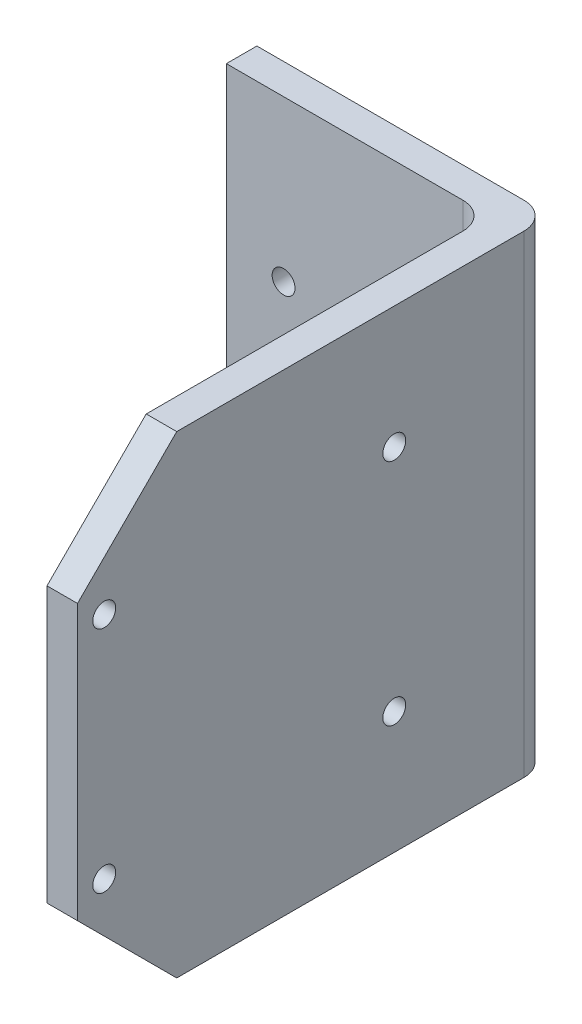
ISO-10303-21;
HEADER;
FILE_DESCRIPTION(('STEP AP214'),'2;1');
FILE_NAME('part.step','',(''),(''),'','','');
FILE_SCHEMA(('AUTOMOTIVE_DESIGN { 1 0 10303 214 1 1 1 1 }'));
ENDSEC;
DATA;
#1=APPLICATION_CONTEXT('core data for automotive mechanical design processes');
#2=APPLICATION_PROTOCOL_DEFINITION('international standard','automotive_design',2000,#1);
#3=PRODUCT_CONTEXT('',#1,'mechanical');
#4=PRODUCT('Part','Part','',(#3));
#5=PRODUCT_RELATED_PRODUCT_CATEGORY('part','',(#4));
#6=PRODUCT_DEFINITION_FORMATION('','',#4);
#7=PRODUCT_DEFINITION_CONTEXT('part definition',#1,'design');
#8=PRODUCT_DEFINITION('design','',#6,#7);
#9=PRODUCT_DEFINITION_SHAPE('','',#8);
#10=(LENGTH_UNIT() NAMED_UNIT(*) SI_UNIT(.MILLI.,.METRE.));
#11=(NAMED_UNIT(*) PLANE_ANGLE_UNIT() SI_UNIT($,.RADIAN.));
#12=(NAMED_UNIT(*) SI_UNIT($,.STERADIAN.) SOLID_ANGLE_UNIT());
#13=UNCERTAINTY_MEASURE_WITH_UNIT(LENGTH_MEASURE(1.E-05),#10,'distance_accuracy_value','');
#14=(GEOMETRIC_REPRESENTATION_CONTEXT(3) GLOBAL_UNCERTAINTY_ASSIGNED_CONTEXT((#13)) GLOBAL_UNIT_ASSIGNED_CONTEXT((#10,
#11,#12)) REPRESENTATION_CONTEXT('',''));
#15=CARTESIAN_POINT('',(0.,0.,0.));
#16=DIRECTION('',(0.,0.,1.));
#17=DIRECTION('',(1.,0.,0.));
#18=AXIS2_PLACEMENT_3D('',#15,#16,#17);
#19=CARTESIAN_POINT('',(6.87397260273973,31.,18.8424657534247));
#20=DIRECTION('',(1.,0.,0.));
#21=DIRECTION('',(0.,0.,-1.));
#22=AXIS2_PLACEMENT_3D('',#19,#20,#21);
#23=PLANE('',#22);
#24=CARTESIAN_POINT('',(6.87397260273973,15.,15.3424657534247));
#25=DIRECTION('',(1.,0.,0.));
#26=DIRECTION('',(0.,0.,-1.));
#27=AXIS2_PLACEMENT_3D('',#24,#25,#26);
#28=CIRCLE('',#27,1.5);
#29=CARTESIAN_POINT('',(6.87397260273973,15.,13.8424657534247));
#30=VERTEX_POINT('',#29);
#31=EDGE_CURVE('E212',#30,#30,#28,.T.);
#32=ORIENTED_EDGE('',*,*,#31,.T.);
#33=EDGE_LOOP('',(#32));
#34=FACE_BOUND('',#33,.T.);
#35=CARTESIAN_POINT('',(6.87397260273973,-15.,-22.6575342465753));
#36=DIRECTION('',(1.,0.,0.));
#37=DIRECTION('',(0.,0.,-1.));
#38=AXIS2_PLACEMENT_3D('',#35,#36,#37);
#39=CIRCLE('',#38,1.5);
#40=CARTESIAN_POINT('',(6.87397260273973,-15.,-24.1575342465753));
#41=VERTEX_POINT('',#40);
#42=EDGE_CURVE('E220',#41,#41,#39,.T.);
#43=ORIENTED_EDGE('',*,*,#42,.T.);
#44=EDGE_LOOP('',(#43));
#45=FACE_BOUND('',#44,.T.);
#46=DIRECTION('',(0.,0.,1.));
#47=VECTOR('',#46,1.);
#48=CARTESIAN_POINT('',(6.87397260273973,31.,18.8424657534247));
#49=LINE('',#48,#47);
#50=CARTESIAN_POINT('',(6.87397260273973,31.,-35.6575342465753));
#51=VERTEX_POINT('',#50);
#52=CARTESIAN_POINT('',(6.87397260273973,31.,5.84246575342466));
#53=VERTEX_POINT('',#52);
#54=EDGE_CURVE('E178',#51,#53,#49,.T.);
#55=ORIENTED_EDGE('',*,*,#54,.F.);
#56=DIRECTION('',(0.,-1.,0.));
#57=VECTOR('',#56,1.);
#58=CARTESIAN_POINT('',(6.87397260273973,-31.,-35.6575342465753));
#59=LINE('',#58,#57);
#60=CARTESIAN_POINT('',(6.87397260273973,-31.,-35.6575342465753));
#61=VERTEX_POINT('',#60);
#62=EDGE_CURVE('E168',#51,#61,#59,.T.);
#63=ORIENTED_EDGE('',*,*,#62,.T.);
#64=DIRECTION('',(0.,0.,1.));
#65=VECTOR('',#64,1.);
#66=CARTESIAN_POINT('',(6.87397260273973,-31.,18.8424657534247));
#67=LINE('',#66,#65);
#68=CARTESIAN_POINT('',(6.87397260273973,-31.,5.84246575342466));
#69=VERTEX_POINT('',#68);
#70=EDGE_CURVE('E176',#61,#69,#67,.T.);
#71=ORIENTED_EDGE('',*,*,#70,.T.);
#72=DIRECTION('',(0.,-0.707106781186548,-0.707106781186548));
#73=VECTOR('',#72,1.);
#74=CARTESIAN_POINT('',(6.87397260273973,6.5,43.3424657534247));
#75=LINE('',#74,#73);
#76=CARTESIAN_POINT('',(6.87397260273973,-18.,18.8424657534247));
#77=VERTEX_POINT('',#76);
#78=EDGE_CURVE('E125',#77,#69,#75,.T.);
#79=ORIENTED_EDGE('',*,*,#78,.F.);
#80=DIRECTION('',(0.,-1.,0.));
#81=VECTOR('',#80,1.);
#82=CARTESIAN_POINT('',(6.87397260273973,31.,18.8424657534247));
#83=LINE('',#82,#81);
#84=CARTESIAN_POINT('',(6.87397260273973,18.,18.8424657534247));
#85=VERTEX_POINT('',#84);
#86=EDGE_CURVE('E142',#85,#77,#83,.T.);
#87=ORIENTED_EDGE('',*,*,#86,.F.);
#88=DIRECTION('',(0.,0.707106781186548,-0.707106781186548));
#89=VECTOR('',#88,1.);
#90=CARTESIAN_POINT('',(6.87397260273973,24.5,12.3424657534247));
#91=LINE('',#90,#89);
#92=EDGE_CURVE('E120',#85,#53,#91,.T.);
#93=ORIENTED_EDGE('',*,*,#92,.T.);
#94=EDGE_LOOP('',(#55,#63,#71,#79,#87,#93));
#95=FACE_BOUND('',#94,.T.);
#96=CARTESIAN_POINT('',(6.87397260273973,15.,-22.6575342465753));
#97=DIRECTION('',(1.,0.,0.));
#98=DIRECTION('',(0.,0.,-1.));
#99=AXIS2_PLACEMENT_3D('',#96,#97,#98);
#100=CIRCLE('',#99,1.5);
#101=CARTESIAN_POINT('',(6.87397260273973,15.,-24.1575342465753));
#102=VERTEX_POINT('',#101);
#103=EDGE_CURVE('E216',#102,#102,#100,.F.);
#104=ORIENTED_EDGE('',*,*,#103,.F.);
#105=EDGE_LOOP('',(#104));
#106=FACE_BOUND('',#105,.T.);
#107=CARTESIAN_POINT('',(6.87397260273973,-15.,15.3424657534247));
#108=DIRECTION('',(1.,0.,0.));
#109=DIRECTION('',(0.,0.,-1.));
#110=AXIS2_PLACEMENT_3D('',#107,#108,#109);
#111=CIRCLE('',#110,1.5);
#112=CARTESIAN_POINT('',(6.87397260273973,-15.,13.8424657534247));
#113=VERTEX_POINT('',#112);
#114=EDGE_CURVE('E203',#113,#113,#111,.F.);
#115=ORIENTED_EDGE('',*,*,#114,.F.);
#116=EDGE_LOOP('',(#115));
#117=FACE_BOUND('',#116,.T.);
#118=ADVANCED_FACE('F39',(#34,#45,#95,#106,#117),#23,.F.);
#119=CARTESIAN_POINT('',(10.8739726027397,31.,18.8424657534247));
#120=DIRECTION('',(0.,0.,-1.));
#121=DIRECTION('',(-1.,0.,0.));
#122=AXIS2_PLACEMENT_3D('',#119,#120,#121);
#123=PLANE('',#122);
#124=DIRECTION('',(0.,-1.,0.));
#125=VECTOR('',#124,1.);
#126=CARTESIAN_POINT('',(10.8739726027397,31.,18.8424657534247));
#127=LINE('',#126,#125);
#128=CARTESIAN_POINT('',(10.8739726027397,18.,18.8424657534247));
#129=VERTEX_POINT('',#128);
#130=CARTESIAN_POINT('',(10.8739726027397,-18.,18.8424657534247));
#131=VERTEX_POINT('',#130);
#132=EDGE_CURVE('E134',#129,#131,#127,.T.);
#133=ORIENTED_EDGE('',*,*,#132,.F.);
#134=DIRECTION('',(1.,0.,0.));
#135=VECTOR('',#134,1.);
#136=CARTESIAN_POINT('',(0.873972602739729,18.,18.8424657534247));
#137=LINE('',#136,#135);
#138=EDGE_CURVE('E113',#85,#129,#137,.T.);
#139=ORIENTED_EDGE('',*,*,#138,.F.);
#140=ORIENTED_EDGE('',*,*,#86,.T.);
#141=DIRECTION('',(1.,0.,0.));
#142=VECTOR('',#141,1.);
#143=CARTESIAN_POINT('',(0.873972602739729,-18.,18.8424657534247));
#144=LINE('',#143,#142);
#145=EDGE_CURVE('E141',#77,#131,#144,.T.);
#146=ORIENTED_EDGE('',*,*,#145,.T.);
#147=EDGE_LOOP('',(#133,#139,#140,#146));
#148=FACE_BOUND('',#147,.T.);
#149=ADVANCED_FACE('F140',(#148),#123,.F.);
#150=CARTESIAN_POINT('',(10.8739726027397,31.,-43.1575342465753));
#151=DIRECTION('',(-1.,0.,0.));
#152=DIRECTION('',(0.,0.,1.));
#153=AXIS2_PLACEMENT_3D('',#150,#151,#152);
#154=PLANE('',#153);
#155=CARTESIAN_POINT('',(10.8739726027397,15.,15.3424657534247));
#156=DIRECTION('',(1.,0.,0.));
#157=DIRECTION('',(0.,0.,-1.));
#158=AXIS2_PLACEMENT_3D('',#155,#156,#157);
#159=CIRCLE('',#158,1.5);
#160=CARTESIAN_POINT('',(10.8739726027397,15.,13.8424657534247));
#161=VERTEX_POINT('',#160);
#162=EDGE_CURVE('E227',#161,#161,#159,.T.);
#163=ORIENTED_EDGE('',*,*,#162,.F.);
#164=EDGE_LOOP('',(#163));
#165=FACE_BOUND('',#164,.T.);
#166=CARTESIAN_POINT('',(10.8739726027397,-15.,-22.6575342465753));
#167=DIRECTION('',(1.,0.,0.));
#168=DIRECTION('',(0.,0.,-1.));
#169=AXIS2_PLACEMENT_3D('',#166,#167,#168);
#170=CIRCLE('',#169,1.5);
#171=CARTESIAN_POINT('',(10.8739726027397,-15.,-24.1575342465753));
#172=VERTEX_POINT('',#171);
#173=EDGE_CURVE('E234',#172,#172,#170,.T.);
#174=ORIENTED_EDGE('',*,*,#173,.F.);
#175=EDGE_LOOP('',(#174));
#176=FACE_BOUND('',#175,.T.);
#177=DIRECTION('',(0.,0.,-1.));
#178=VECTOR('',#177,1.);
#179=CARTESIAN_POINT('',(10.8739726027397,-31.,-43.1575342465753));
#180=LINE('',#179,#178);
#181=CARTESIAN_POINT('',(10.8739726027397,-31.,5.84246575342466));
#182=VERTEX_POINT('',#181);
#183=CARTESIAN_POINT('',(10.8739726027397,-31.,-39.6575342465753));
#184=VERTEX_POINT('',#183);
#185=EDGE_CURVE('E184',#182,#184,#180,.T.);
#186=ORIENTED_EDGE('',*,*,#185,.T.);
#187=DIRECTION('',(0.,-1.,0.));
#188=VECTOR('',#187,1.);
#189=CARTESIAN_POINT('',(10.8739726027397,31.,-39.6575342465753));
#190=LINE('',#189,#188);
#191=CARTESIAN_POINT('',(10.8739726027397,31.,-39.6575342465753));
#192=VERTEX_POINT('',#191);
#193=EDGE_CURVE('E164',#184,#192,#190,.F.);
#194=ORIENTED_EDGE('',*,*,#193,.T.);
#195=DIRECTION('',(0.,0.,-1.));
#196=VECTOR('',#195,1.);
#197=CARTESIAN_POINT('',(10.8739726027397,31.,-43.1575342465753));
#198=LINE('',#197,#196);
#199=CARTESIAN_POINT('',(10.8739726027397,31.,5.84246575342466));
#200=VERTEX_POINT('',#199);
#201=EDGE_CURVE('E136',#200,#192,#198,.T.);
#202=ORIENTED_EDGE('',*,*,#201,.F.);
#203=DIRECTION('',(0.,0.707106781186548,-0.707106781186548));
#204=VECTOR('',#203,1.);
#205=CARTESIAN_POINT('',(10.8739726027397,18.4212328767123,18.4212328767123));
#206=LINE('',#205,#204);
#207=EDGE_CURVE('E117',#129,#200,#206,.T.);
#208=ORIENTED_EDGE('',*,*,#207,.F.);
#209=ORIENTED_EDGE('',*,*,#132,.T.);
#210=DIRECTION('',(0.,-0.707106781186548,-0.707106781186548));
#211=VECTOR('',#210,1.);
#212=CARTESIAN_POINT('',(10.8739726027397,-18.4212328767123,18.4212328767123));
#213=LINE('',#212,#211);
#214=EDGE_CURVE('E137',#131,#182,#213,.T.);
#215=ORIENTED_EDGE('',*,*,#214,.T.);
#216=EDGE_LOOP('',(#186,#194,#202,#208,#209,#215));
#217=FACE_BOUND('',#216,.T.);
#218=CARTESIAN_POINT('',(10.8739726027397,15.,-22.6575342465753));
#219=DIRECTION('',(-1.,0.,0.));
#220=DIRECTION('',(0.,0.,1.));
#221=AXIS2_PLACEMENT_3D('',#218,#219,#220);
#222=CIRCLE('',#221,1.5);
#223=CARTESIAN_POINT('',(10.8739726027397,15.,-21.1575342465753));
#224=VERTEX_POINT('',#223);
#225=EDGE_CURVE('E230',#224,#224,#222,.T.);
#226=ORIENTED_EDGE('',*,*,#225,.T.);
#227=EDGE_LOOP('',(#226));
#228=FACE_BOUND('',#227,.T.);
#229=CARTESIAN_POINT('',(10.8739726027397,-15.,15.3424657534247));
#230=DIRECTION('',(-1.,0.,0.));
#231=DIRECTION('',(0.,0.,1.));
#232=AXIS2_PLACEMENT_3D('',#229,#230,#231);
#233=CIRCLE('',#232,1.5);
#234=CARTESIAN_POINT('',(10.8739726027397,-15.,16.8424657534247));
#235=VERTEX_POINT('',#234);
#236=EDGE_CURVE('E231',#235,#235,#233,.T.);
#237=ORIENTED_EDGE('',*,*,#236,.T.);
#238=EDGE_LOOP('',(#237));
#239=FACE_BOUND('',#238,.T.);
#240=ADVANCED_FACE('F131',(#165,#176,#217,#228,#239),#154,.F.);
#241=CARTESIAN_POINT('',(0.,-31.,0.));
#242=DIRECTION('',(0.,-1.,0.));
#243=DIRECTION('',(0.,0.,-1.));
#244=AXIS2_PLACEMENT_3D('',#241,#242,#243);
#245=PLANE('',#244);
#246=DIRECTION('',(-1.,0.,0.));
#247=VECTOR('',#246,1.);
#248=CARTESIAN_POINT('',(-27.6260273972603,-31.,-43.1575342465753));
#249=LINE('',#248,#247);
#250=CARTESIAN_POINT('',(7.37397260273973,-31.,-43.1575342465753));
#251=VERTEX_POINT('',#250);
#252=CARTESIAN_POINT('',(-27.6260273972603,-31.,-43.1575342465753));
#253=VERTEX_POINT('',#252);
#254=EDGE_CURVE('E187',#251,#253,#249,.T.);
#255=ORIENTED_EDGE('',*,*,#254,.F.);
#256=CARTESIAN_POINT('',(7.37397260273973,-31.,-39.6575342465753));
#257=DIRECTION('',(0.,-1.,0.));
#258=DIRECTION('',(0.,0.,-1.));
#259=AXIS2_PLACEMENT_3D('',#256,#257,#258);
#260=CIRCLE('',#259,3.5);
#261=EDGE_CURVE('E162',#251,#184,#260,.T.);
#262=ORIENTED_EDGE('',*,*,#261,.T.);
#263=ORIENTED_EDGE('',*,*,#185,.F.);
#264=DIRECTION('',(-1.,0.,0.));
#265=VECTOR('',#264,1.);
#266=CARTESIAN_POINT('',(0.,-31.,5.84246575342466));
#267=LINE('',#266,#265);
#268=EDGE_CURVE('E154',#182,#69,#267,.T.);
#269=ORIENTED_EDGE('',*,*,#268,.T.);
#270=ORIENTED_EDGE('',*,*,#70,.F.);
#271=CARTESIAN_POINT('',(3.37397260273973,-31.,-35.6575342465753));
#272=DIRECTION('',(0.,-1.,0.));
#273=DIRECTION('',(0.,0.,-1.));
#274=AXIS2_PLACEMENT_3D('',#271,#272,#273);
#275=CIRCLE('',#274,3.5);
#276=CARTESIAN_POINT('',(3.37397260273973,-31.,-39.1575342465753));
#277=VERTEX_POINT('',#276);
#278=EDGE_CURVE('E47',#61,#277,#275,.F.);
#279=ORIENTED_EDGE('',*,*,#278,.T.);
#280=DIRECTION('',(1.,0.,0.));
#281=VECTOR('',#280,1.);
#282=CARTESIAN_POINT('',(6.87397260273973,-31.,-39.1575342465753));
#283=LINE('',#282,#281);
#284=CARTESIAN_POINT('',(-27.6260273972603,-31.,-39.1575342465753));
#285=VERTEX_POINT('',#284);
#286=EDGE_CURVE('E185',#285,#277,#283,.T.);
#287=ORIENTED_EDGE('',*,*,#286,.F.);
#288=DIRECTION('',(0.,0.,1.));
#289=VECTOR('',#288,1.);
#290=CARTESIAN_POINT('',(-27.6260273972603,-31.,-39.1575342465753));
#291=LINE('',#290,#289);
#292=EDGE_CURVE('E189',#253,#285,#291,.T.);
#293=ORIENTED_EDGE('',*,*,#292,.F.);
#294=EDGE_LOOP('',(#255,#262,#263,#269,#270,#279,#287,#293));
#295=FACE_BOUND('',#294,.T.);
#296=ADVANCED_FACE('F182',(#295),#245,.T.);
#297=CARTESIAN_POINT('',(-27.6260273972603,31.,-39.1575342465753));
#298=DIRECTION('',(1.,0.,0.));
#299=DIRECTION('',(0.,0.,-1.));
#300=AXIS2_PLACEMENT_3D('',#297,#298,#299);
#301=PLANE('',#300);
#302=ORIENTED_EDGE('',*,*,#292,.T.);
#303=DIRECTION('',(0.,-1.,0.));
#304=VECTOR('',#303,1.);
#305=CARTESIAN_POINT('',(-27.6260273972603,31.,-39.1575342465753));
#306=LINE('',#305,#304);
#307=CARTESIAN_POINT('',(-27.6260273972603,31.,-39.1575342465753));
#308=VERTEX_POINT('',#307);
#309=EDGE_CURVE('E145',#308,#285,#306,.T.);
#310=ORIENTED_EDGE('',*,*,#309,.F.);
#311=DIRECTION('',(0.,0.,1.));
#312=VECTOR('',#311,1.);
#313=CARTESIAN_POINT('',(-27.6260273972603,31.,-39.1575342465753));
#314=LINE('',#313,#312);
#315=CARTESIAN_POINT('',(-27.6260273972603,31.,-43.1575342465753));
#316=VERTEX_POINT('',#315);
#317=EDGE_CURVE('E192',#316,#308,#314,.T.);
#318=ORIENTED_EDGE('',*,*,#317,.F.);
#319=DIRECTION('',(0.,-1.,0.));
#320=VECTOR('',#319,1.);
#321=CARTESIAN_POINT('',(-27.6260273972603,31.,-43.1575342465753));
#322=LINE('',#321,#320);
#323=EDGE_CURVE('E143',#316,#253,#322,.T.);
#324=ORIENTED_EDGE('',*,*,#323,.T.);
#325=EDGE_LOOP('',(#302,#310,#318,#324));
#326=FACE_BOUND('',#325,.T.);
#327=ADVANCED_FACE('F294',(#326),#301,.F.);
#328=CARTESIAN_POINT('',(6.87397260273973,31.,-39.1575342465753));
#329=DIRECTION('',(0.,0.,-1.));
#330=DIRECTION('',(-1.,0.,0.));
#331=AXIS2_PLACEMENT_3D('',#328,#329,#330);
#332=PLANE('',#331);
#333=CARTESIAN_POINT('',(-20.1260273972603,10.,-39.1575342465753));
#334=DIRECTION('',(0.,0.,-1.));
#335=DIRECTION('',(-1.,0.,0.));
#336=AXIS2_PLACEMENT_3D('',#333,#334,#335);
#337=CIRCLE('',#336,1.5);
#338=CARTESIAN_POINT('',(-21.6260273972603,10.,-39.1575342465753));
#339=VERTEX_POINT('',#338);
#340=EDGE_CURVE('E240',#339,#339,#337,.T.);
#341=ORIENTED_EDGE('',*,*,#340,.T.);
#342=EDGE_LOOP('',(#341));
#343=FACE_BOUND('',#342,.T.);
#344=CARTESIAN_POINT('',(-20.1260273972603,-10.,-39.1575342465753));
#345=DIRECTION('',(0.,0.,-1.));
#346=DIRECTION('',(-1.,0.,0.));
#347=AXIS2_PLACEMENT_3D('',#344,#345,#346);
#348=CIRCLE('',#347,1.5);
#349=CARTESIAN_POINT('',(-21.6260273972603,-10.,-39.1575342465753));
#350=VERTEX_POINT('',#349);
#351=EDGE_CURVE('E244',#350,#350,#348,.T.);
#352=ORIENTED_EDGE('',*,*,#351,.T.);
#353=EDGE_LOOP('',(#352));
#354=FACE_BOUND('',#353,.T.);
#355=ORIENTED_EDGE('',*,*,#286,.T.);
#356=DIRECTION('',(0.,-1.,0.));
#357=VECTOR('',#356,1.);
#358=CARTESIAN_POINT('',(3.37397260273973,31.,-39.1575342465753));
#359=LINE('',#358,#357);
#360=CARTESIAN_POINT('',(3.37397260273973,31.,-39.1575342465753));
#361=VERTEX_POINT('',#360);
#362=EDGE_CURVE('E54',#277,#361,#359,.F.);
#363=ORIENTED_EDGE('',*,*,#362,.T.);
#364=DIRECTION('',(1.,0.,0.));
#365=VECTOR('',#364,1.);
#366=CARTESIAN_POINT('',(6.87397260273973,31.,-39.1575342465753));
#367=LINE('',#366,#365);
#368=EDGE_CURVE('E196',#308,#361,#367,.T.);
#369=ORIENTED_EDGE('',*,*,#368,.F.);
#370=ORIENTED_EDGE('',*,*,#309,.T.);
#371=EDGE_LOOP('',(#355,#363,#369,#370));
#372=FACE_BOUND('',#371,.T.);
#373=ADVANCED_FACE('F261',(#343,#354,#372),#332,.F.);
#374=CARTESIAN_POINT('',(-27.6260273972603,31.,-43.1575342465753));
#375=DIRECTION('',(0.,0.,1.));
#376=DIRECTION('',(1.,0.,0.));
#377=AXIS2_PLACEMENT_3D('',#374,#375,#376);
#378=PLANE('',#377);
#379=CARTESIAN_POINT('',(-20.1260273972603,10.,-43.1575342465753));
#380=DIRECTION('',(0.,0.,-1.));
#381=DIRECTION('',(-1.,0.,0.));
#382=AXIS2_PLACEMENT_3D('',#379,#380,#381);
#383=CIRCLE('',#382,1.5);
#384=CARTESIAN_POINT('',(-21.6260273972603,10.,-43.1575342465753));
#385=VERTEX_POINT('',#384);
#386=EDGE_CURVE('E247',#385,#385,#383,.T.);
#387=ORIENTED_EDGE('',*,*,#386,.F.);
#388=EDGE_LOOP('',(#387));
#389=FACE_BOUND('',#388,.T.);
#390=CARTESIAN_POINT('',(-20.1260273972603,-10.,-43.1575342465753));
#391=DIRECTION('',(0.,0.,-1.));
#392=DIRECTION('',(-1.,0.,0.));
#393=AXIS2_PLACEMENT_3D('',#390,#391,#392);
#394=CIRCLE('',#393,1.5);
#395=CARTESIAN_POINT('',(-21.6260273972603,-10.,-43.1575342465753));
#396=VERTEX_POINT('',#395);
#397=EDGE_CURVE('E248',#396,#396,#394,.T.);
#398=ORIENTED_EDGE('',*,*,#397,.F.);
#399=EDGE_LOOP('',(#398));
#400=FACE_BOUND('',#399,.T.);
#401=DIRECTION('',(-1.,0.,0.));
#402=VECTOR('',#401,1.);
#403=CARTESIAN_POINT('',(-27.6260273972603,31.,-43.1575342465753));
#404=LINE('',#403,#402);
#405=CARTESIAN_POINT('',(7.37397260273973,31.,-43.1575342465753));
#406=VERTEX_POINT('',#405);
#407=EDGE_CURVE('E148',#406,#316,#404,.T.);
#408=ORIENTED_EDGE('',*,*,#407,.F.);
#409=DIRECTION('',(0.,-1.,0.));
#410=VECTOR('',#409,1.);
#411=CARTESIAN_POINT('',(7.37397260273973,31.,-43.1575342465753));
#412=LINE('',#411,#410);
#413=EDGE_CURVE('E159',#406,#251,#412,.T.);
#414=ORIENTED_EDGE('',*,*,#413,.T.);
#415=ORIENTED_EDGE('',*,*,#254,.T.);
#416=ORIENTED_EDGE('',*,*,#323,.F.);
#417=EDGE_LOOP('',(#408,#414,#415,#416));
#418=FACE_BOUND('',#417,.T.);
#419=ADVANCED_FACE('F257',(#389,#400,#418),#378,.F.);
#420=CARTESIAN_POINT('',(0.,31.,0.));
#421=DIRECTION('',(0.,-1.,0.));
#422=DIRECTION('',(0.,0.,-1.));
#423=AXIS2_PLACEMENT_3D('',#420,#421,#422);
#424=PLANE('',#423);
#425=ORIENTED_EDGE('',*,*,#201,.T.);
#426=CARTESIAN_POINT('',(7.37397260273973,31.,-39.6575342465753));
#427=DIRECTION('',(0.,-1.,0.));
#428=DIRECTION('',(0.,0.,-1.));
#429=AXIS2_PLACEMENT_3D('',#426,#427,#428);
#430=CIRCLE('',#429,3.5);
#431=EDGE_CURVE('E166',#192,#406,#430,.F.);
#432=ORIENTED_EDGE('',*,*,#431,.T.);
#433=ORIENTED_EDGE('',*,*,#407,.T.);
#434=ORIENTED_EDGE('',*,*,#317,.T.);
#435=ORIENTED_EDGE('',*,*,#368,.T.);
#436=CARTESIAN_POINT('',(3.37397260273973,31.,-35.6575342465753));
#437=DIRECTION('',(0.,-1.,0.));
#438=DIRECTION('',(0.,0.,-1.));
#439=AXIS2_PLACEMENT_3D('',#436,#437,#438);
#440=CIRCLE('',#439,3.5);
#441=EDGE_CURVE('E11',#361,#51,#440,.T.);
#442=ORIENTED_EDGE('',*,*,#441,.T.);
#443=ORIENTED_EDGE('',*,*,#54,.T.);
#444=DIRECTION('',(1.,0.,0.));
#445=VECTOR('',#444,1.);
#446=CARTESIAN_POINT('',(0.,31.,5.84246575342466));
#447=LINE('',#446,#445);
#448=EDGE_CURVE('E157',#53,#200,#447,.T.);
#449=ORIENTED_EDGE('',*,*,#448,.T.);
#450=EDGE_LOOP('',(#425,#432,#433,#434,#435,#442,#443,#449));
#451=FACE_BOUND('',#450,.T.);
#452=ADVANCED_FACE('F260',(#451),#424,.F.);
#453=CARTESIAN_POINT('',(0.873972602739729,-18.4212328767123,18.4212328767123));
#454=DIRECTION('',(0.,-0.707106781186548,0.707106781186548));
#455=DIRECTION('',(0.,-0.707106781186548,-0.707106781186548));
#456=AXIS2_PLACEMENT_3D('',#453,#454,#455);
#457=PLANE('',#456);
#458=ORIENTED_EDGE('',*,*,#78,.T.);
#459=ORIENTED_EDGE('',*,*,#268,.F.);
#460=ORIENTED_EDGE('',*,*,#214,.F.);
#461=ORIENTED_EDGE('',*,*,#145,.F.);
#462=EDGE_LOOP('',(#458,#459,#460,#461));
#463=FACE_BOUND('',#462,.T.);
#464=ADVANCED_FACE('F271',(#463),#457,.T.);
#465=CARTESIAN_POINT('',(0.873972602739729,18.4212328767123,18.4212328767123));
#466=DIRECTION('',(0.,-0.707106781186548,-0.707106781186548));
#467=DIRECTION('',(0.,0.707106781186548,-0.707106781186548));
#468=AXIS2_PLACEMENT_3D('',#465,#466,#467);
#469=PLANE('',#468);
#470=ORIENTED_EDGE('',*,*,#138,.T.);
#471=ORIENTED_EDGE('',*,*,#207,.T.);
#472=ORIENTED_EDGE('',*,*,#448,.F.);
#473=ORIENTED_EDGE('',*,*,#92,.F.);
#474=EDGE_LOOP('',(#470,#471,#472,#473));
#475=FACE_BOUND('',#474,.T.);
#476=ADVANCED_FACE('F115',(#475),#469,.F.);
#477=CARTESIAN_POINT('',(0.873972602739725,-15.,-22.6575342465753));
#478=DIRECTION('',(1.,0.,0.));
#479=DIRECTION('',(0.,0.,-1.));
#480=AXIS2_PLACEMENT_3D('',#477,#478,#479);
#481=CYLINDRICAL_SURFACE('',#480,1.5);
#482=ORIENTED_EDGE('',*,*,#173,.T.);
#483=EDGE_LOOP('',(#482));
#484=FACE_BOUND('',#483,.T.);
#485=ORIENTED_EDGE('',*,*,#42,.F.);
#486=EDGE_LOOP('',(#485));
#487=FACE_BOUND('',#486,.T.);
#488=ADVANCED_FACE('F278',(#484,#487),#481,.F.);
#489=CARTESIAN_POINT('',(0.873972602739725,15.,-22.6575342465753));
#490=DIRECTION('',(1.,0.,0.));
#491=DIRECTION('',(0.,0.,-1.));
#492=AXIS2_PLACEMENT_3D('',#489,#490,#491);
#493=CYLINDRICAL_SURFACE('',#492,1.5);
#494=ORIENTED_EDGE('',*,*,#225,.F.);
#495=EDGE_LOOP('',(#494));
#496=FACE_BOUND('',#495,.T.);
#497=ORIENTED_EDGE('',*,*,#103,.T.);
#498=EDGE_LOOP('',(#497));
#499=FACE_BOUND('',#498,.T.);
#500=ADVANCED_FACE('F309',(#496,#499),#493,.F.);
#501=CARTESIAN_POINT('',(0.873972602739729,15.,15.3424657534247));
#502=DIRECTION('',(1.,0.,0.));
#503=DIRECTION('',(0.,0.,-1.));
#504=AXIS2_PLACEMENT_3D('',#501,#502,#503);
#505=CYLINDRICAL_SURFACE('',#504,1.5);
#506=ORIENTED_EDGE('',*,*,#162,.T.);
#507=EDGE_LOOP('',(#506));
#508=FACE_BOUND('',#507,.T.);
#509=ORIENTED_EDGE('',*,*,#31,.F.);
#510=EDGE_LOOP('',(#509));
#511=FACE_BOUND('',#510,.T.);
#512=ADVANCED_FACE('F304',(#508,#511),#505,.F.);
#513=CARTESIAN_POINT('',(0.873972602739729,-15.,15.3424657534247));
#514=DIRECTION('',(1.,0.,0.));
#515=DIRECTION('',(0.,0.,-1.));
#516=AXIS2_PLACEMENT_3D('',#513,#514,#515);
#517=CYLINDRICAL_SURFACE('',#516,1.5);
#518=ORIENTED_EDGE('',*,*,#236,.F.);
#519=EDGE_LOOP('',(#518));
#520=FACE_BOUND('',#519,.T.);
#521=ORIENTED_EDGE('',*,*,#114,.T.);
#522=EDGE_LOOP('',(#521));
#523=FACE_BOUND('',#522,.T.);
#524=ADVANCED_FACE('F298',(#520,#523),#517,.F.);
#525=CARTESIAN_POINT('',(7.37397260273973,31.,-39.6575342465753));
#526=DIRECTION('',(0.,-1.,0.));
#527=DIRECTION('',(0.,0.,-1.));
#528=AXIS2_PLACEMENT_3D('',#525,#526,#527);
#529=CYLINDRICAL_SURFACE('',#528,3.5);
#530=ORIENTED_EDGE('',*,*,#431,.F.);
#531=ORIENTED_EDGE('',*,*,#193,.F.);
#532=ORIENTED_EDGE('',*,*,#261,.F.);
#533=ORIENTED_EDGE('',*,*,#413,.F.);
#534=EDGE_LOOP('',(#530,#531,#532,#533));
#535=FACE_BOUND('',#534,.T.);
#536=ADVANCED_FACE('F268',(#535),#529,.T.);
#537=CARTESIAN_POINT('',(3.37397260273973,31.,-35.6575342465753));
#538=DIRECTION('',(0.,1.,0.));
#539=DIRECTION('',(0.,0.,1.));
#540=AXIS2_PLACEMENT_3D('',#537,#538,#539);
#541=CYLINDRICAL_SURFACE('',#540,3.5);
#542=ORIENTED_EDGE('',*,*,#441,.F.);
#543=ORIENTED_EDGE('',*,*,#362,.F.);
#544=ORIENTED_EDGE('',*,*,#278,.F.);
#545=ORIENTED_EDGE('',*,*,#62,.F.);
#546=EDGE_LOOP('',(#542,#543,#544,#545));
#547=FACE_BOUND('',#546,.T.);
#548=ADVANCED_FACE('F41',(#547),#541,.F.);
#549=CARTESIAN_POINT('',(-20.1260273972603,-10.,-33.1575342465753));
#550=DIRECTION('',(0.,0.,-1.));
#551=DIRECTION('',(-1.,0.,0.));
#552=AXIS2_PLACEMENT_3D('',#549,#550,#551);
#553=CYLINDRICAL_SURFACE('',#552,1.5);
#554=ORIENTED_EDGE('',*,*,#397,.T.);
#555=EDGE_LOOP('',(#554));
#556=FACE_BOUND('',#555,.T.);
#557=ORIENTED_EDGE('',*,*,#351,.F.);
#558=EDGE_LOOP('',(#557));
#559=FACE_BOUND('',#558,.T.);
#560=ADVANCED_FACE('F303',(#556,#559),#553,.F.);
#561=CARTESIAN_POINT('',(-20.1260273972603,10.,-33.1575342465753));
#562=DIRECTION('',(0.,0.,-1.));
#563=DIRECTION('',(-1.,0.,0.));
#564=AXIS2_PLACEMENT_3D('',#561,#562,#563);
#565=CYLINDRICAL_SURFACE('',#564,1.5);
#566=ORIENTED_EDGE('',*,*,#386,.T.);
#567=EDGE_LOOP('',(#566));
#568=FACE_BOUND('',#567,.T.);
#569=ORIENTED_EDGE('',*,*,#340,.F.);
#570=EDGE_LOOP('',(#569));
#571=FACE_BOUND('',#570,.T.);
#572=ADVANCED_FACE('F254',(#568,#571),#565,.F.);
#573=CLOSED_SHELL('',(#118,#149,#240,#296,#327,#373,#419,#452,#464,#476,#488,#500,#512,#524,
#536,#548,#560,#572));
#574=MANIFOLD_SOLID_BREP('B2',#573);
#575=ADVANCED_BREP_SHAPE_REPRESENTATION('',(#18,#574),#14);
#576=SHAPE_DEFINITION_REPRESENTATION(#9,#575);
ENDSEC;
END-ISO-10303-21;
